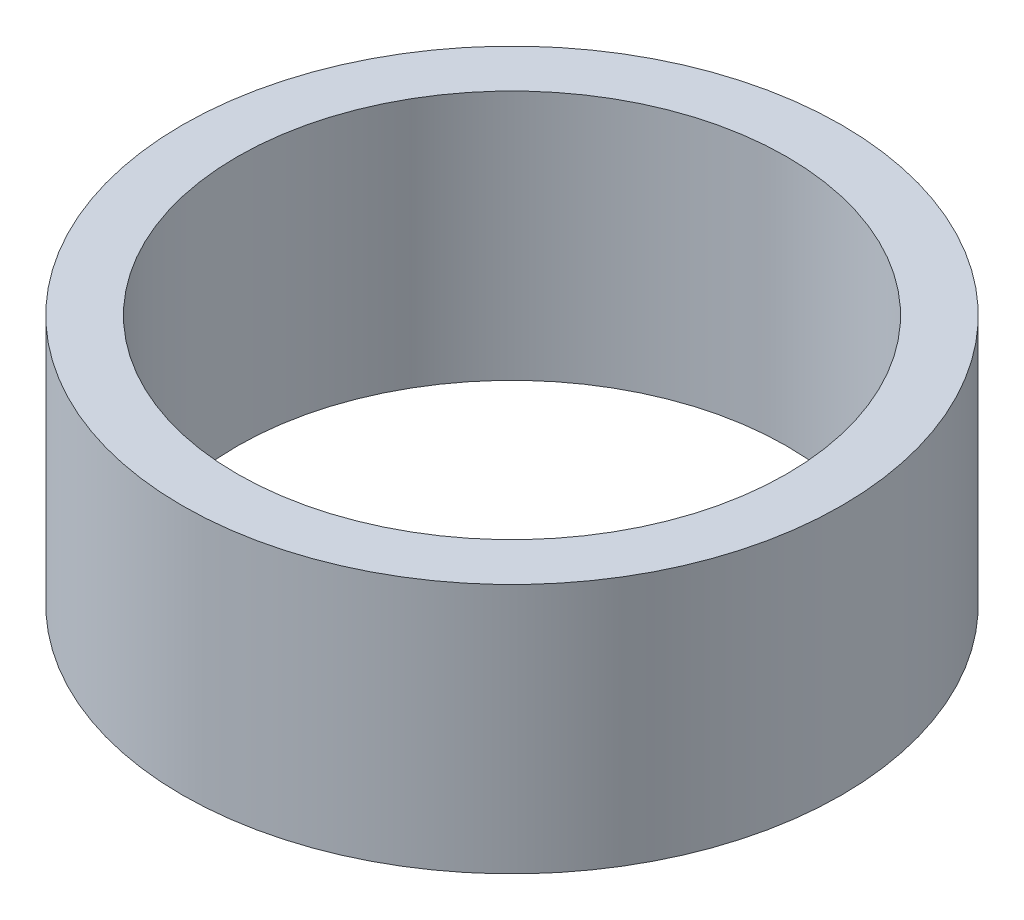
ISO-10303-21;
HEADER;
FILE_DESCRIPTION(('STEP AP214'),'2;1');
FILE_NAME('part.step','',(''),(''),'','','');
FILE_SCHEMA(('AUTOMOTIVE_DESIGN { 1 0 10303 214 1 1 1 1 }'));
ENDSEC;
DATA;
#1=APPLICATION_CONTEXT('core data for automotive mechanical design processes');
#2=APPLICATION_PROTOCOL_DEFINITION('international standard','automotive_design',2000,#1);
#3=PRODUCT_CONTEXT('',#1,'mechanical');
#4=PRODUCT('Part','Part','',(#3));
#5=PRODUCT_RELATED_PRODUCT_CATEGORY('part','',(#4));
#6=PRODUCT_DEFINITION_FORMATION('','',#4);
#7=PRODUCT_DEFINITION_CONTEXT('part definition',#1,'design');
#8=PRODUCT_DEFINITION('design','',#6,#7);
#9=PRODUCT_DEFINITION_SHAPE('','',#8);
#10=(LENGTH_UNIT() NAMED_UNIT(*) SI_UNIT(.MILLI.,.METRE.));
#11=(NAMED_UNIT(*) PLANE_ANGLE_UNIT() SI_UNIT($,.RADIAN.));
#12=(NAMED_UNIT(*) SI_UNIT($,.STERADIAN.) SOLID_ANGLE_UNIT());
#13=UNCERTAINTY_MEASURE_WITH_UNIT(LENGTH_MEASURE(1.E-05),#10,'distance_accuracy_value','');
#14=(GEOMETRIC_REPRESENTATION_CONTEXT(3) GLOBAL_UNCERTAINTY_ASSIGNED_CONTEXT((#13)) GLOBAL_UNIT_ASSIGNED_CONTEXT((#10,
#11,#12)) REPRESENTATION_CONTEXT('',''));
#15=CARTESIAN_POINT('',(0.,0.,0.));
#16=DIRECTION('',(0.,0.,1.));
#17=DIRECTION('',(1.,0.,0.));
#18=AXIS2_PLACEMENT_3D('',#15,#16,#17);
#19=CARTESIAN_POINT('',(0.,2.28,0.));
#20=DIRECTION('',(0.,1.,0.));
#21=DIRECTION('',(0.,0.,1.));
#22=AXIS2_PLACEMENT_3D('',#19,#20,#21);
#23=PLANE('',#22);
#24=CARTESIAN_POINT('',(0.,2.28,0.));
#25=DIRECTION('',(0.,1.,0.));
#26=DIRECTION('',(0.,0.,1.));
#27=AXIS2_PLACEMENT_3D('',#24,#25,#26);
#28=CIRCLE('',#27,3.);
#29=CARTESIAN_POINT('',(0.,2.28,3.));
#30=VERTEX_POINT('',#29);
#31=EDGE_CURVE('E10',#30,#30,#28,.T.);
#32=ORIENTED_EDGE('',*,*,#31,.T.);
#33=EDGE_LOOP('',(#32));
#34=FACE_BOUND('',#33,.T.);
#35=CARTESIAN_POINT('',(0.,2.28,0.));
#36=DIRECTION('',(0.,1.,0.));
#37=DIRECTION('',(0.,0.,1.));
#38=AXIS2_PLACEMENT_3D('',#35,#36,#37);
#39=CIRCLE('',#38,2.5);
#40=CARTESIAN_POINT('',(0.,2.28,2.5));
#41=VERTEX_POINT('',#40);
#42=EDGE_CURVE('E43',#41,#41,#39,.T.);
#43=ORIENTED_EDGE('',*,*,#42,.F.);
#44=EDGE_LOOP('',(#43));
#45=FACE_BOUND('',#44,.T.);
#46=ADVANCED_FACE('F32',(#34,#45),#23,.T.);
#47=CARTESIAN_POINT('',(0.,0.,0.));
#48=DIRECTION('',(0.,1.,0.));
#49=DIRECTION('',(0.,0.,1.));
#50=AXIS2_PLACEMENT_3D('',#47,#48,#49);
#51=PLANE('',#50);
#52=CARTESIAN_POINT('',(0.,0.,0.));
#53=DIRECTION('',(0.,1.,0.));
#54=DIRECTION('',(0.,0.,1.));
#55=AXIS2_PLACEMENT_3D('',#52,#53,#54);
#56=CIRCLE('',#55,3.);
#57=CARTESIAN_POINT('',(0.,0.,3.));
#58=VERTEX_POINT('',#57);
#59=EDGE_CURVE('E36',#58,#58,#56,.T.);
#60=ORIENTED_EDGE('',*,*,#59,.F.);
#61=EDGE_LOOP('',(#60));
#62=FACE_BOUND('',#61,.T.);
#63=CARTESIAN_POINT('',(0.,0.,0.));
#64=DIRECTION('',(0.,1.,0.));
#65=DIRECTION('',(0.,0.,1.));
#66=AXIS2_PLACEMENT_3D('',#63,#64,#65);
#67=CIRCLE('',#66,2.5);
#68=CARTESIAN_POINT('',(0.,0.,2.5));
#69=VERTEX_POINT('',#68);
#70=EDGE_CURVE('E45',#69,#69,#67,.T.);
#71=ORIENTED_EDGE('',*,*,#70,.T.);
#72=EDGE_LOOP('',(#71));
#73=FACE_BOUND('',#72,.T.);
#74=ADVANCED_FACE('F55',(#62,#73),#51,.F.);
#75=CARTESIAN_POINT('',(0.,2.28,0.));
#76=DIRECTION('',(0.,-1.,0.));
#77=DIRECTION('',(0.,0.,-1.));
#78=AXIS2_PLACEMENT_3D('',#75,#76,#77);
#79=CYLINDRICAL_SURFACE('',#78,3.);
#80=ORIENTED_EDGE('',*,*,#31,.F.);
#81=EDGE_LOOP('',(#80));
#82=FACE_BOUND('',#81,.T.);
#83=ORIENTED_EDGE('',*,*,#59,.T.);
#84=EDGE_LOOP('',(#83));
#85=FACE_BOUND('',#84,.T.);
#86=ADVANCED_FACE('F34',(#82,#85),#79,.T.);
#87=CARTESIAN_POINT('',(0.,2.28,0.));
#88=DIRECTION('',(0.,-1.,0.));
#89=DIRECTION('',(0.,0.,-1.));
#90=AXIS2_PLACEMENT_3D('',#87,#88,#89);
#91=CYLINDRICAL_SURFACE('',#90,2.5);
#92=ORIENTED_EDGE('',*,*,#42,.T.);
#93=EDGE_LOOP('',(#92));
#94=FACE_BOUND('',#93,.T.);
#95=ORIENTED_EDGE('',*,*,#70,.F.);
#96=EDGE_LOOP('',(#95));
#97=FACE_BOUND('',#96,.T.);
#98=ADVANCED_FACE('F51',(#94,#97),#91,.F.);
#99=CLOSED_SHELL('',(#46,#74,#86,#98));
#100=MANIFOLD_SOLID_BREP('B2',#99);
#101=ADVANCED_BREP_SHAPE_REPRESENTATION('',(#18,#100),#14);
#102=SHAPE_DEFINITION_REPRESENTATION(#9,#101);
ENDSEC;
END-ISO-10303-21;
